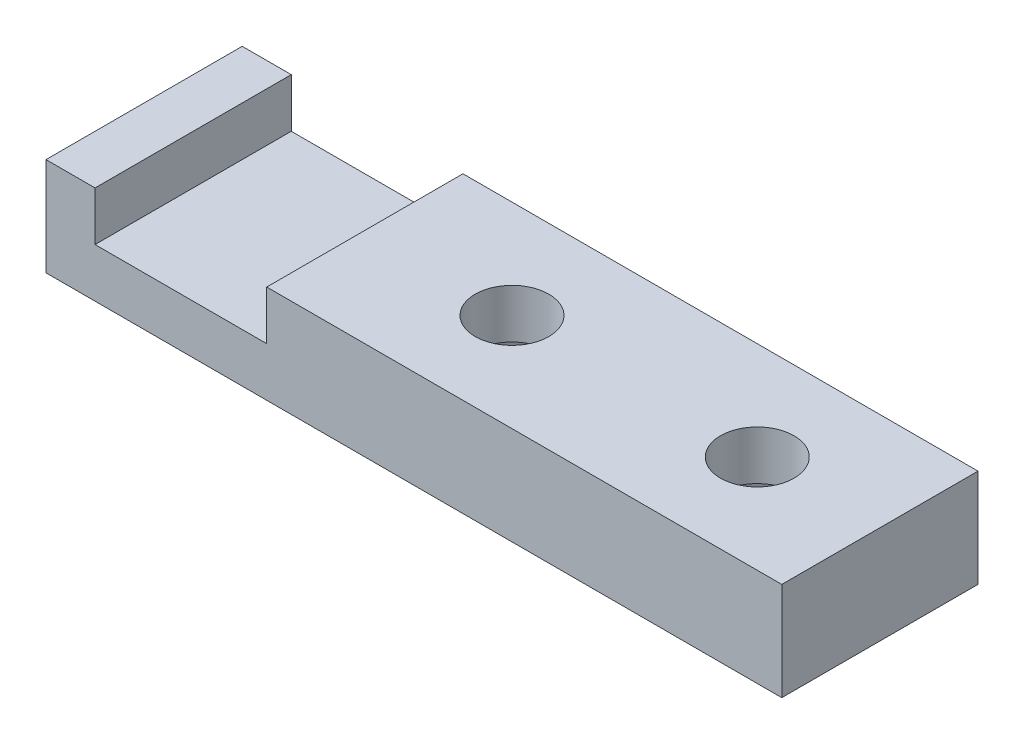
ISO-10303-21;
HEADER;
FILE_DESCRIPTION(('STEP AP214'),'2;1');
FILE_NAME('part.step','',(''),(''),'','','');
FILE_SCHEMA(('AUTOMOTIVE_DESIGN { 1 0 10303 214 1 1 1 1 }'));
ENDSEC;
DATA;
#1=APPLICATION_CONTEXT('core data for automotive mechanical design processes');
#2=APPLICATION_PROTOCOL_DEFINITION('international standard','automotive_design',2000,#1);
#3=PRODUCT_CONTEXT('',#1,'mechanical');
#4=PRODUCT('Part','Part','',(#3));
#5=PRODUCT_RELATED_PRODUCT_CATEGORY('part','',(#4));
#6=PRODUCT_DEFINITION_FORMATION('','',#4);
#7=PRODUCT_DEFINITION_CONTEXT('part definition',#1,'design');
#8=PRODUCT_DEFINITION('design','',#6,#7);
#9=PRODUCT_DEFINITION_SHAPE('','',#8);
#10=(LENGTH_UNIT() NAMED_UNIT(*) SI_UNIT(.MILLI.,.METRE.));
#11=(NAMED_UNIT(*) PLANE_ANGLE_UNIT() SI_UNIT($,.RADIAN.));
#12=(NAMED_UNIT(*) SI_UNIT($,.STERADIAN.) SOLID_ANGLE_UNIT());
#13=UNCERTAINTY_MEASURE_WITH_UNIT(LENGTH_MEASURE(1.E-05),#10,'distance_accuracy_value','');
#14=(GEOMETRIC_REPRESENTATION_CONTEXT(3) GLOBAL_UNCERTAINTY_ASSIGNED_CONTEXT((#13)) GLOBAL_UNIT_ASSIGNED_CONTEXT((#10,
#11,#12)) REPRESENTATION_CONTEXT('',''));
#15=CARTESIAN_POINT('',(0.,0.,0.));
#16=DIRECTION('',(0.,0.,1.));
#17=DIRECTION('',(1.,0.,0.));
#18=AXIS2_PLACEMENT_3D('',#15,#16,#17);
#19=CARTESIAN_POINT('',(15.,10.,4.));
#20=DIRECTION('',(0.,-1.,0.));
#21=DIRECTION('',(0.,0.,-1.));
#22=AXIS2_PLACEMENT_3D('',#19,#20,#21);
#23=CYLINDRICAL_SURFACE('',#22,1.5);
#24=CARTESIAN_POINT('',(15.,4.,4.));
#25=DIRECTION('',(0.,-1.,0.));
#26=DIRECTION('',(0.,0.,-1.));
#27=AXIS2_PLACEMENT_3D('',#24,#25,#26);
#28=CIRCLE('',#27,1.5);
#29=CARTESIAN_POINT('',(15.,4.,2.5));
#30=VERTEX_POINT('',#29);
#31=EDGE_CURVE('E334',#30,#30,#28,.T.);
#32=ORIENTED_EDGE('',*,*,#31,.F.);
#33=EDGE_LOOP('',(#32));
#34=FACE_BOUND('',#33,.T.);
#35=CARTESIAN_POINT('',(15.,2.,4.));
#36=DIRECTION('',(0.,-1.,0.));
#37=DIRECTION('',(0.,0.,-1.));
#38=AXIS2_PLACEMENT_3D('',#35,#36,#37);
#39=CIRCLE('',#38,1.5);
#40=CARTESIAN_POINT('',(15.,2.,2.5));
#41=VERTEX_POINT('',#40);
#42=EDGE_CURVE('E36',#41,#41,#39,.F.);
#43=ORIENTED_EDGE('',*,*,#42,.F.);
#44=EDGE_LOOP('',(#43));
#45=FACE_BOUND('',#44,.T.);
#46=ADVANCED_FACE('F32',(#34,#45),#23,.F.);
#47=CARTESIAN_POINT('',(25.,10.,4.));
#48=DIRECTION('',(0.,-1.,0.));
#49=DIRECTION('',(0.,0.,-1.));
#50=AXIS2_PLACEMENT_3D('',#47,#48,#49);
#51=CYLINDRICAL_SURFACE('',#50,1.5);
#52=CARTESIAN_POINT('',(25.,4.,4.));
#53=DIRECTION('',(0.,-1.,0.));
#54=DIRECTION('',(0.,0.,-1.));
#55=AXIS2_PLACEMENT_3D('',#52,#53,#54);
#56=CIRCLE('',#55,1.5);
#57=CARTESIAN_POINT('',(25.,4.,2.5));
#58=VERTEX_POINT('',#57);
#59=EDGE_CURVE('E277',#58,#58,#56,.T.);
#60=ORIENTED_EDGE('',*,*,#59,.F.);
#61=EDGE_LOOP('',(#60));
#62=FACE_BOUND('',#61,.T.);
#63=CARTESIAN_POINT('',(25.,2.,4.));
#64=DIRECTION('',(0.,-1.,0.));
#65=DIRECTION('',(0.,0.,-1.));
#66=AXIS2_PLACEMENT_3D('',#63,#64,#65);
#67=CIRCLE('',#66,1.5);
#68=CARTESIAN_POINT('',(25.,2.,2.5));
#69=VERTEX_POINT('',#68);
#70=EDGE_CURVE('E263',#69,#69,#67,.F.);
#71=ORIENTED_EDGE('',*,*,#70,.F.);
#72=EDGE_LOOP('',(#71));
#73=FACE_BOUND('',#72,.T.);
#74=ADVANCED_FACE('F341',(#62,#73),#51,.F.);
#75=CARTESIAN_POINT('',(0.,4.,8.));
#76=DIRECTION('',(0.,-1.,0.));
#77=DIRECTION('',(0.,0.,-1.));
#78=AXIS2_PLACEMENT_3D('',#75,#76,#77);
#79=PLANE('',#78);
#80=DIRECTION('',(-1.,0.,0.));
#81=VECTOR('',#80,1.);
#82=CARTESIAN_POINT('',(0.,4.,8.));
#83=LINE('',#82,#81);
#84=CARTESIAN_POINT('',(2.,4.,8.));
#85=VERTEX_POINT('',#84);
#86=CARTESIAN_POINT('',(0.,4.,8.));
#87=VERTEX_POINT('',#86);
#88=EDGE_CURVE('E319',#85,#87,#83,.T.);
#89=ORIENTED_EDGE('',*,*,#88,.F.);
#90=DIRECTION('',(0.,0.,1.));
#91=VECTOR('',#90,1.);
#92=CARTESIAN_POINT('',(2.,4.,0.));
#93=LINE('',#92,#91);
#94=CARTESIAN_POINT('',(2.,4.,0.));
#95=VERTEX_POINT('',#94);
#96=EDGE_CURVE('E304',#95,#85,#93,.T.);
#97=ORIENTED_EDGE('',*,*,#96,.F.);
#98=DIRECTION('',(-1.,0.,0.));
#99=VECTOR('',#98,1.);
#100=CARTESIAN_POINT('',(0.,4.,0.));
#101=LINE('',#100,#99);
#102=CARTESIAN_POINT('',(0.,4.,0.));
#103=VERTEX_POINT('',#102);
#104=EDGE_CURVE('E327',#95,#103,#101,.T.);
#105=ORIENTED_EDGE('',*,*,#104,.T.);
#106=DIRECTION('',(0.,0.,-1.));
#107=VECTOR('',#106,1.);
#108=CARTESIAN_POINT('',(0.,4.,8.));
#109=LINE('',#108,#107);
#110=EDGE_CURVE('E41',#87,#103,#109,.T.);
#111=ORIENTED_EDGE('',*,*,#110,.F.);
#112=EDGE_LOOP('',(#89,#97,#105,#111));
#113=FACE_BOUND('',#112,.T.);
#114=ADVANCED_FACE('F343',(#113),#79,.F.);
#115=CARTESIAN_POINT('',(0.,0.,8.));
#116=DIRECTION('',(1.,0.,0.));
#117=DIRECTION('',(0.,0.,-1.));
#118=AXIS2_PLACEMENT_3D('',#115,#116,#117);
#119=PLANE('',#118);
#120=DIRECTION('',(0.,-1.,0.));
#121=VECTOR('',#120,1.);
#122=CARTESIAN_POINT('',(0.,0.,0.));
#123=LINE('',#122,#121);
#124=CARTESIAN_POINT('',(0.,0.,0.));
#125=VERTEX_POINT('',#124);
#126=EDGE_CURVE('E306',#103,#125,#123,.T.);
#127=ORIENTED_EDGE('',*,*,#126,.T.);
#128=DIRECTION('',(0.,0.,-1.));
#129=VECTOR('',#128,1.);
#130=CARTESIAN_POINT('',(0.,0.,8.));
#131=LINE('',#130,#129);
#132=CARTESIAN_POINT('',(0.,0.,8.));
#133=VERTEX_POINT('',#132);
#134=EDGE_CURVE('E11',#133,#125,#131,.T.);
#135=ORIENTED_EDGE('',*,*,#134,.F.);
#136=DIRECTION('',(0.,-1.,0.));
#137=VECTOR('',#136,1.);
#138=CARTESIAN_POINT('',(0.,0.,8.));
#139=LINE('',#138,#137);
#140=EDGE_CURVE('E313',#87,#133,#139,.T.);
#141=ORIENTED_EDGE('',*,*,#140,.F.);
#142=ORIENTED_EDGE('',*,*,#110,.T.);
#143=EDGE_LOOP('',(#127,#135,#141,#142));
#144=FACE_BOUND('',#143,.T.);
#145=ADVANCED_FACE('F34',(#144),#119,.F.);
#146=CARTESIAN_POINT('',(0.,0.,8.));
#147=DIRECTION('',(0.,1.,0.));
#148=DIRECTION('',(0.,0.,1.));
#149=AXIS2_PLACEMENT_3D('',#146,#147,#148);
#150=PLANE('',#149);
#151=DIRECTION('',(0.5,0.,-0.866025403784439));
#152=VECTOR('',#151,1.);
#153=CARTESIAN_POINT('',(12.,0.,4.));
#154=LINE('',#153,#152);
#155=CARTESIAN_POINT('',(12.,0.,4.));
#156=VERTEX_POINT('',#155);
#157=CARTESIAN_POINT('',(13.5,0.,1.40192378864669));
#158=VERTEX_POINT('',#157);
#159=EDGE_CURVE('E207',#156,#158,#154,.T.);
#160=ORIENTED_EDGE('',*,*,#159,.F.);
#161=DIRECTION('',(-0.5,0.,-0.866025403784439));
#162=VECTOR('',#161,1.);
#163=CARTESIAN_POINT('',(13.5,0.,6.59807621135331));
#164=LINE('',#163,#162);
#165=CARTESIAN_POINT('',(13.5,0.,6.59807621135331));
#166=VERTEX_POINT('',#165);
#167=EDGE_CURVE('E49',#166,#156,#164,.T.);
#168=ORIENTED_EDGE('',*,*,#167,.F.);
#169=DIRECTION('',(-1.,0.,0.));
#170=VECTOR('',#169,1.);
#171=CARTESIAN_POINT('',(16.5,0.,6.59807621135331));
#172=LINE('',#171,#170);
#173=CARTESIAN_POINT('',(16.5,0.,6.59807621135331));
#174=VERTEX_POINT('',#173);
#175=EDGE_CURVE('E193',#174,#166,#172,.T.);
#176=ORIENTED_EDGE('',*,*,#175,.F.);
#177=DIRECTION('',(-0.5,0.,0.866025403784438));
#178=VECTOR('',#177,1.);
#179=CARTESIAN_POINT('',(18.,0.,4.));
#180=LINE('',#179,#178);
#181=CARTESIAN_POINT('',(18.,0.,4.));
#182=VERTEX_POINT('',#181);
#183=EDGE_CURVE('E196',#182,#174,#180,.T.);
#184=ORIENTED_EDGE('',*,*,#183,.F.);
#185=DIRECTION('',(0.5,0.,0.866025403784438));
#186=VECTOR('',#185,1.);
#187=CARTESIAN_POINT('',(16.5,0.,1.40192378864669));
#188=LINE('',#187,#186);
#189=CARTESIAN_POINT('',(16.5,0.,1.40192378864669));
#190=VERTEX_POINT('',#189);
#191=EDGE_CURVE('E212',#190,#182,#188,.T.);
#192=ORIENTED_EDGE('',*,*,#191,.F.);
#193=DIRECTION('',(1.,0.,0.));
#194=VECTOR('',#193,1.);
#195=CARTESIAN_POINT('',(13.5,0.,1.40192378864669));
#196=LINE('',#195,#194);
#197=EDGE_CURVE('E209',#158,#190,#196,.T.);
#198=ORIENTED_EDGE('',*,*,#197,.F.);
#199=EDGE_LOOP('',(#160,#168,#176,#184,#192,#198));
#200=FACE_BOUND('',#199,.T.);
#201=DIRECTION('',(0.5,0.,-0.866025403784438));
#202=VECTOR('',#201,1.);
#203=CARTESIAN_POINT('',(22.,0.,4.));
#204=LINE('',#203,#202);
#205=CARTESIAN_POINT('',(22.,0.,4.));
#206=VERTEX_POINT('',#205);
#207=CARTESIAN_POINT('',(23.5,0.,1.40192378864668));
#208=VERTEX_POINT('',#207);
#209=EDGE_CURVE('E247',#206,#208,#204,.T.);
#210=ORIENTED_EDGE('',*,*,#209,.F.);
#211=DIRECTION('',(-0.5,0.,-0.866025403784439));
#212=VECTOR('',#211,1.);
#213=CARTESIAN_POINT('',(23.5,0.,6.59807621135332));
#214=LINE('',#213,#212);
#215=CARTESIAN_POINT('',(23.5,0.,6.59807621135332));
#216=VERTEX_POINT('',#215);
#217=EDGE_CURVE('E57',#216,#206,#214,.T.);
#218=ORIENTED_EDGE('',*,*,#217,.F.);
#219=DIRECTION('',(-1.,0.,0.));
#220=VECTOR('',#219,1.);
#221=CARTESIAN_POINT('',(26.5,0.,6.59807621135332));
#222=LINE('',#221,#220);
#223=CARTESIAN_POINT('',(26.5,0.,6.59807621135332));
#224=VERTEX_POINT('',#223);
#225=EDGE_CURVE('E230',#224,#216,#222,.T.);
#226=ORIENTED_EDGE('',*,*,#225,.F.);
#227=DIRECTION('',(-0.5,0.,0.866025403784438));
#228=VECTOR('',#227,1.);
#229=CARTESIAN_POINT('',(28.,0.,4.));
#230=LINE('',#229,#228);
#231=CARTESIAN_POINT('',(28.,0.,4.));
#232=VERTEX_POINT('',#231);
#233=EDGE_CURVE('E256',#232,#224,#230,.T.);
#234=ORIENTED_EDGE('',*,*,#233,.F.);
#235=DIRECTION('',(0.499999999999999,0.,0.866025403784439));
#236=VECTOR('',#235,1.);
#237=CARTESIAN_POINT('',(26.5,0.,1.40192378864668));
#238=LINE('',#237,#236);
#239=CARTESIAN_POINT('',(26.5,0.,1.40192378864668));
#240=VERTEX_POINT('',#239);
#241=EDGE_CURVE('E253',#240,#232,#238,.T.);
#242=ORIENTED_EDGE('',*,*,#241,.F.);
#243=DIRECTION('',(1.,0.,0.));
#244=VECTOR('',#243,1.);
#245=CARTESIAN_POINT('',(23.5,0.,1.40192378864668));
#246=LINE('',#245,#244);
#247=EDGE_CURVE('E250',#208,#240,#246,.T.);
#248=ORIENTED_EDGE('',*,*,#247,.F.);
#249=EDGE_LOOP('',(#210,#218,#226,#234,#242,#248));
#250=FACE_BOUND('',#249,.T.);
#251=DIRECTION('',(1.,0.,0.));
#252=VECTOR('',#251,1.);
#253=CARTESIAN_POINT('',(0.,0.,0.));
#254=LINE('',#253,#252);
#255=CARTESIAN_POINT('',(30.,0.,0.));
#256=VERTEX_POINT('',#255);
#257=EDGE_CURVE('E325',#125,#256,#254,.T.);
#258=ORIENTED_EDGE('',*,*,#257,.T.);
#259=DIRECTION('',(0.,0.,-1.));
#260=VECTOR('',#259,1.);
#261=CARTESIAN_POINT('',(30.,0.,8.));
#262=LINE('',#261,#260);
#263=CARTESIAN_POINT('',(30.,0.,8.));
#264=VERTEX_POINT('',#263);
#265=EDGE_CURVE('E276',#264,#256,#262,.T.);
#266=ORIENTED_EDGE('',*,*,#265,.F.);
#267=DIRECTION('',(1.,0.,0.));
#268=VECTOR('',#267,1.);
#269=CARTESIAN_POINT('',(0.,0.,8.));
#270=LINE('',#269,#268);
#271=EDGE_CURVE('E316',#133,#264,#270,.T.);
#272=ORIENTED_EDGE('',*,*,#271,.F.);
#273=ORIENTED_EDGE('',*,*,#134,.T.);
#274=EDGE_LOOP('',(#258,#266,#272,#273));
#275=FACE_BOUND('',#274,.T.);
#276=ADVANCED_FACE('F382',(#200,#250,#275),#150,.F.);
#277=ORIENTED_EDGE('',*,*,#31,.T.);
#278=EDGE_LOOP('',(#277));
#279=FACE_BOUND('',#278,.T.);
#280=ORIENTED_EDGE('',*,*,#59,.T.);
#281=EDGE_LOOP('',(#280));
#282=FACE_BOUND('',#281,.T.);
#283=CARTESIAN_POINT('',(30.,4.00000000000001,0.));
#284=VERTEX_POINT('',#283);
#285=CARTESIAN_POINT('',(9.,4.,0.));
#286=VERTEX_POINT('',#285);
#287=EDGE_CURVE('E317',#284,#286,#101,.T.);
#288=ORIENTED_EDGE('',*,*,#287,.T.);
#289=DIRECTION('',(0.,0.,1.));
#290=VECTOR('',#289,1.);
#291=CARTESIAN_POINT('',(9.,4.,0.));
#292=LINE('',#291,#290);
#293=CARTESIAN_POINT('',(9.,4.,8.));
#294=VERTEX_POINT('',#293);
#295=EDGE_CURVE('E307',#286,#294,#292,.T.);
#296=ORIENTED_EDGE('',*,*,#295,.T.);
#297=CARTESIAN_POINT('',(30.,4.00000000000001,8.));
#298=VERTEX_POINT('',#297);
#299=EDGE_CURVE('E320',#298,#294,#83,.T.);
#300=ORIENTED_EDGE('',*,*,#299,.F.);
#301=DIRECTION('',(0.,0.,1.));
#302=VECTOR('',#301,1.);
#303=CARTESIAN_POINT('',(30.,4.00000000000001,8.));
#304=LINE('',#303,#302);
#305=EDGE_CURVE('E283',#284,#298,#304,.T.);
#306=ORIENTED_EDGE('',*,*,#305,.F.);
#307=EDGE_LOOP('',(#288,#296,#300,#306));
#308=FACE_BOUND('',#307,.T.);
#309=ADVANCED_FACE('F352',(#279,#282,#308),#79,.F.);
#310=CARTESIAN_POINT('',(0.,0.,8.));
#311=DIRECTION('',(0.,0.,-1.));
#312=DIRECTION('',(-1.,0.,0.));
#313=AXIS2_PLACEMENT_3D('',#310,#311,#312);
#314=PLANE('',#313);
#315=DIRECTION('',(1.,0.,0.));
#316=VECTOR('',#315,1.);
#317=CARTESIAN_POINT('',(2.,2.,8.));
#318=LINE('',#317,#316);
#319=CARTESIAN_POINT('',(2.,2.,8.));
#320=VERTEX_POINT('',#319);
#321=CARTESIAN_POINT('',(9.,2.,8.));
#322=VERTEX_POINT('',#321);
#323=EDGE_CURVE('E300',#320,#322,#318,.T.);
#324=ORIENTED_EDGE('',*,*,#323,.F.);
#325=DIRECTION('',(0.,-1.,0.));
#326=VECTOR('',#325,1.);
#327=CARTESIAN_POINT('',(2.,4.,8.));
#328=LINE('',#327,#326);
#329=EDGE_CURVE('E286',#85,#320,#328,.T.);
#330=ORIENTED_EDGE('',*,*,#329,.F.);
#331=ORIENTED_EDGE('',*,*,#88,.T.);
#332=ORIENTED_EDGE('',*,*,#140,.T.);
#333=ORIENTED_EDGE('',*,*,#271,.T.);
#334=DIRECTION('',(0.,-1.,0.));
#335=VECTOR('',#334,1.);
#336=CARTESIAN_POINT('',(30.,0.,8.));
#337=LINE('',#336,#335);
#338=EDGE_CURVE('E273',#298,#264,#337,.T.);
#339=ORIENTED_EDGE('',*,*,#338,.F.);
#340=ORIENTED_EDGE('',*,*,#299,.T.);
#341=DIRECTION('',(0.,1.,0.));
#342=VECTOR('',#341,1.);
#343=CARTESIAN_POINT('',(9.,4.,8.));
#344=LINE('',#343,#342);
#345=EDGE_CURVE('E291',#322,#294,#344,.T.);
#346=ORIENTED_EDGE('',*,*,#345,.F.);
#347=EDGE_LOOP('',(#324,#330,#331,#332,#333,#339,#340,#346));
#348=FACE_BOUND('',#347,.T.);
#349=ADVANCED_FACE('F375',(#348),#314,.F.);
#350=CARTESIAN_POINT('',(0.,0.,0.));
#351=DIRECTION('',(0.,0.,-1.));
#352=DIRECTION('',(-1.,0.,0.));
#353=AXIS2_PLACEMENT_3D('',#350,#351,#352);
#354=PLANE('',#353);
#355=DIRECTION('',(0.,-1.,0.));
#356=VECTOR('',#355,1.);
#357=CARTESIAN_POINT('',(2.,4.,0.));
#358=LINE('',#357,#356);
#359=CARTESIAN_POINT('',(2.,2.,0.));
#360=VERTEX_POINT('',#359);
#361=EDGE_CURVE('E287',#95,#360,#358,.T.);
#362=ORIENTED_EDGE('',*,*,#361,.T.);
#363=DIRECTION('',(1.,0.,0.));
#364=VECTOR('',#363,1.);
#365=CARTESIAN_POINT('',(2.,2.,0.));
#366=LINE('',#365,#364);
#367=CARTESIAN_POINT('',(9.,2.,0.));
#368=VERTEX_POINT('',#367);
#369=EDGE_CURVE('E290',#360,#368,#366,.T.);
#370=ORIENTED_EDGE('',*,*,#369,.T.);
#371=DIRECTION('',(0.,1.,0.));
#372=VECTOR('',#371,1.);
#373=CARTESIAN_POINT('',(9.,4.,0.));
#374=LINE('',#373,#372);
#375=EDGE_CURVE('E294',#368,#286,#374,.T.);
#376=ORIENTED_EDGE('',*,*,#375,.T.);
#377=ORIENTED_EDGE('',*,*,#287,.F.);
#378=DIRECTION('',(0.,1.,0.));
#379=VECTOR('',#378,1.);
#380=CARTESIAN_POINT('',(30.,0.,0.));
#381=LINE('',#380,#379);
#382=EDGE_CURVE('E280',#256,#284,#381,.T.);
#383=ORIENTED_EDGE('',*,*,#382,.F.);
#384=ORIENTED_EDGE('',*,*,#257,.F.);
#385=ORIENTED_EDGE('',*,*,#126,.F.);
#386=ORIENTED_EDGE('',*,*,#104,.F.);
#387=EDGE_LOOP('',(#362,#370,#376,#377,#383,#384,#385,#386));
#388=FACE_BOUND('',#387,.T.);
#389=ADVANCED_FACE('F373',(#388),#354,.T.);
#390=CARTESIAN_POINT('',(2.,4.,0.));
#391=DIRECTION('',(-1.,0.,0.));
#392=DIRECTION('',(0.,-1.,0.));
#393=AXIS2_PLACEMENT_3D('',#390,#391,#392);
#394=PLANE('',#393);
#395=ORIENTED_EDGE('',*,*,#329,.T.);
#396=DIRECTION('',(0.,0.,1.));
#397=VECTOR('',#396,1.);
#398=CARTESIAN_POINT('',(2.,2.,0.));
#399=LINE('',#398,#397);
#400=EDGE_CURVE('E297',#360,#320,#399,.T.);
#401=ORIENTED_EDGE('',*,*,#400,.F.);
#402=ORIENTED_EDGE('',*,*,#361,.F.);
#403=ORIENTED_EDGE('',*,*,#96,.T.);
#404=EDGE_LOOP('',(#395,#401,#402,#403));
#405=FACE_BOUND('',#404,.T.);
#406=ADVANCED_FACE('F366',(#405),#394,.F.);
#407=CARTESIAN_POINT('',(9.,4.,0.));
#408=DIRECTION('',(1.,0.,0.));
#409=DIRECTION('',(0.,0.,-1.));
#410=AXIS2_PLACEMENT_3D('',#407,#408,#409);
#411=PLANE('',#410);
#412=ORIENTED_EDGE('',*,*,#345,.T.);
#413=ORIENTED_EDGE('',*,*,#295,.F.);
#414=ORIENTED_EDGE('',*,*,#375,.F.);
#415=DIRECTION('',(0.,0.,1.));
#416=VECTOR('',#415,1.);
#417=CARTESIAN_POINT('',(9.,2.,0.));
#418=LINE('',#417,#416);
#419=EDGE_CURVE('E310',#368,#322,#418,.T.);
#420=ORIENTED_EDGE('',*,*,#419,.T.);
#421=EDGE_LOOP('',(#412,#413,#414,#420));
#422=FACE_BOUND('',#421,.T.);
#423=ADVANCED_FACE('F363',(#422),#411,.F.);
#424=CARTESIAN_POINT('',(2.,2.,0.));
#425=DIRECTION('',(0.,-1.,0.));
#426=DIRECTION('',(0.,0.,-1.));
#427=AXIS2_PLACEMENT_3D('',#424,#425,#426);
#428=PLANE('',#427);
#429=ORIENTED_EDGE('',*,*,#323,.T.);
#430=ORIENTED_EDGE('',*,*,#419,.F.);
#431=ORIENTED_EDGE('',*,*,#369,.F.);
#432=ORIENTED_EDGE('',*,*,#400,.T.);
#433=EDGE_LOOP('',(#429,#430,#431,#432));
#434=FACE_BOUND('',#433,.T.);
#435=ADVANCED_FACE('F361',(#434),#428,.F.);
#436=CARTESIAN_POINT('',(30.,0.,0.));
#437=DIRECTION('',(-1.,0.,0.));
#438=DIRECTION('',(0.,-1.,0.));
#439=AXIS2_PLACEMENT_3D('',#436,#437,#438);
#440=PLANE('',#439);
#441=ORIENTED_EDGE('',*,*,#338,.T.);
#442=ORIENTED_EDGE('',*,*,#265,.T.);
#443=ORIENTED_EDGE('',*,*,#382,.T.);
#444=ORIENTED_EDGE('',*,*,#305,.T.);
#445=EDGE_LOOP('',(#441,#442,#443,#444));
#446=FACE_BOUND('',#445,.T.);
#447=ADVANCED_FACE('F358',(#446),#440,.F.);
#448=CARTESIAN_POINT('',(0.,2.,0.));
#449=DIRECTION('',(0.,-1.,0.));
#450=DIRECTION('',(0.,0.,-1.));
#451=AXIS2_PLACEMENT_3D('',#448,#449,#450);
#452=PLANE('',#451);
#453=DIRECTION('',(-0.5,0.,-0.866025403784439));
#454=VECTOR('',#453,1.);
#455=CARTESIAN_POINT('',(23.5,2.,6.59807621135332));
#456=LINE('',#455,#454);
#457=CARTESIAN_POINT('',(23.5,2.,6.59807621135332));
#458=VERTEX_POINT('',#457);
#459=CARTESIAN_POINT('',(22.,2.,4.));
#460=VERTEX_POINT('',#459);
#461=EDGE_CURVE('E226',#458,#460,#456,.T.);
#462=ORIENTED_EDGE('',*,*,#461,.T.);
#463=DIRECTION('',(0.5,0.,-0.866025403784438));
#464=VECTOR('',#463,1.);
#465=CARTESIAN_POINT('',(22.,2.,4.));
#466=LINE('',#465,#464);
#467=CARTESIAN_POINT('',(23.5,2.,1.40192378864668));
#468=VERTEX_POINT('',#467);
#469=EDGE_CURVE('E229',#460,#468,#466,.T.);
#470=ORIENTED_EDGE('',*,*,#469,.T.);
#471=DIRECTION('',(1.,0.,0.));
#472=VECTOR('',#471,1.);
#473=CARTESIAN_POINT('',(23.5,2.,1.40192378864668));
#474=LINE('',#473,#472);
#475=CARTESIAN_POINT('',(26.5,2.,1.40192378864668));
#476=VERTEX_POINT('',#475);
#477=EDGE_CURVE('E233',#468,#476,#474,.T.);
#478=ORIENTED_EDGE('',*,*,#477,.T.);
#479=DIRECTION('',(0.499999999999999,0.,0.866025403784439));
#480=VECTOR('',#479,1.);
#481=CARTESIAN_POINT('',(26.5,2.,1.40192378864668));
#482=LINE('',#481,#480);
#483=CARTESIAN_POINT('',(28.,2.,4.));
#484=VERTEX_POINT('',#483);
#485=EDGE_CURVE('E236',#476,#484,#482,.T.);
#486=ORIENTED_EDGE('',*,*,#485,.T.);
#487=DIRECTION('',(-0.5,0.,0.866025403784438));
#488=VECTOR('',#487,1.);
#489=CARTESIAN_POINT('',(28.,2.,4.));
#490=LINE('',#489,#488);
#491=CARTESIAN_POINT('',(26.5,2.,6.59807621135332));
#492=VERTEX_POINT('',#491);
#493=EDGE_CURVE('E239',#484,#492,#490,.T.);
#494=ORIENTED_EDGE('',*,*,#493,.T.);
#495=DIRECTION('',(-1.,0.,0.));
#496=VECTOR('',#495,1.);
#497=CARTESIAN_POINT('',(26.5,2.,6.59807621135332));
#498=LINE('',#497,#496);
#499=EDGE_CURVE('E242',#492,#458,#498,.T.);
#500=ORIENTED_EDGE('',*,*,#499,.T.);
#501=EDGE_LOOP('',(#462,#470,#478,#486,#494,#500));
#502=FACE_BOUND('',#501,.T.);
#503=ORIENTED_EDGE('',*,*,#70,.T.);
#504=EDGE_LOOP('',(#503));
#505=FACE_BOUND('',#504,.T.);
#506=ADVANCED_FACE('F339',(#502,#505),#452,.T.);
#507=CARTESIAN_POINT('',(23.5,2.,6.59807621135332));
#508=DIRECTION('',(-0.866025403784439,0.,0.5));
#509=DIRECTION('',(0.5,0.,0.866025403784439));
#510=AXIS2_PLACEMENT_3D('',#507,#508,#509);
#511=PLANE('',#510);
#512=ORIENTED_EDGE('',*,*,#217,.T.);
#513=DIRECTION('',(0.,-1.,0.));
#514=VECTOR('',#513,1.);
#515=CARTESIAN_POINT('',(22.,2.,4.));
#516=LINE('',#515,#514);
#517=EDGE_CURVE('E245',#460,#206,#516,.T.);
#518=ORIENTED_EDGE('',*,*,#517,.F.);
#519=ORIENTED_EDGE('',*,*,#461,.F.);
#520=DIRECTION('',(0.,-1.,0.));
#521=VECTOR('',#520,1.);
#522=CARTESIAN_POINT('',(23.5,2.,6.59807621135332));
#523=LINE('',#522,#521);
#524=EDGE_CURVE('E261',#458,#216,#523,.T.);
#525=ORIENTED_EDGE('',*,*,#524,.T.);
#526=EDGE_LOOP('',(#512,#518,#519,#525));
#527=FACE_BOUND('',#526,.T.);
#528=ADVANCED_FACE('F419',(#527),#511,.F.);
#529=CARTESIAN_POINT('',(26.5,2.,6.59807621135332));
#530=DIRECTION('',(0.,0.,1.));
#531=DIRECTION('',(1.,0.,0.));
#532=AXIS2_PLACEMENT_3D('',#529,#530,#531);
#533=PLANE('',#532);
#534=ORIENTED_EDGE('',*,*,#225,.T.);
#535=ORIENTED_EDGE('',*,*,#524,.F.);
#536=ORIENTED_EDGE('',*,*,#499,.F.);
#537=DIRECTION('',(0.,-1.,0.));
#538=VECTOR('',#537,1.);
#539=CARTESIAN_POINT('',(26.5,2.,6.59807621135332));
#540=LINE('',#539,#538);
#541=EDGE_CURVE('E264',#492,#224,#540,.T.);
#542=ORIENTED_EDGE('',*,*,#541,.T.);
#543=EDGE_LOOP('',(#534,#535,#536,#542));
#544=FACE_BOUND('',#543,.T.);
#545=ADVANCED_FACE('F424',(#544),#533,.F.);
#546=CARTESIAN_POINT('',(28.,2.,4.));
#547=DIRECTION('',(0.866025403784439,0.,0.5));
#548=DIRECTION('',(0.5,0.,-0.866025403784438));
#549=AXIS2_PLACEMENT_3D('',#546,#547,#548);
#550=PLANE('',#549);
#551=ORIENTED_EDGE('',*,*,#233,.T.);
#552=ORIENTED_EDGE('',*,*,#541,.F.);
#553=ORIENTED_EDGE('',*,*,#493,.F.);
#554=DIRECTION('',(0.,-1.,0.));
#555=VECTOR('',#554,1.);
#556=CARTESIAN_POINT('',(28.,2.,4.));
#557=LINE('',#556,#555);
#558=EDGE_CURVE('E266',#484,#232,#557,.T.);
#559=ORIENTED_EDGE('',*,*,#558,.T.);
#560=EDGE_LOOP('',(#551,#552,#553,#559));
#561=FACE_BOUND('',#560,.T.);
#562=ADVANCED_FACE('F427',(#561),#550,.F.);
#563=CARTESIAN_POINT('',(26.5,2.,1.40192378864668));
#564=DIRECTION('',(0.866025403784439,0.,-0.499999999999999));
#565=DIRECTION('',(-0.499999999999999,0.,-0.866025403784439));
#566=AXIS2_PLACEMENT_3D('',#563,#564,#565);
#567=PLANE('',#566);
#568=ORIENTED_EDGE('',*,*,#241,.T.);
#569=ORIENTED_EDGE('',*,*,#558,.F.);
#570=ORIENTED_EDGE('',*,*,#485,.F.);
#571=DIRECTION('',(0.,-1.,0.));
#572=VECTOR('',#571,1.);
#573=CARTESIAN_POINT('',(26.5,2.,1.40192378864668));
#574=LINE('',#573,#572);
#575=EDGE_CURVE('E268',#476,#240,#574,.T.);
#576=ORIENTED_EDGE('',*,*,#575,.T.);
#577=EDGE_LOOP('',(#568,#569,#570,#576));
#578=FACE_BOUND('',#577,.T.);
#579=ADVANCED_FACE('F430',(#578),#567,.F.);
#580=CARTESIAN_POINT('',(23.5,2.,1.40192378864668));
#581=DIRECTION('',(0.,0.,-1.));
#582=DIRECTION('',(-1.,0.,0.));
#583=AXIS2_PLACEMENT_3D('',#580,#581,#582);
#584=PLANE('',#583);
#585=ORIENTED_EDGE('',*,*,#247,.T.);
#586=ORIENTED_EDGE('',*,*,#575,.F.);
#587=ORIENTED_EDGE('',*,*,#477,.F.);
#588=DIRECTION('',(0.,-1.,0.));
#589=VECTOR('',#588,1.);
#590=CARTESIAN_POINT('',(23.5,2.,1.40192378864668));
#591=LINE('',#590,#589);
#592=EDGE_CURVE('E270',#468,#208,#591,.T.);
#593=ORIENTED_EDGE('',*,*,#592,.T.);
#594=EDGE_LOOP('',(#585,#586,#587,#593));
#595=FACE_BOUND('',#594,.T.);
#596=ADVANCED_FACE('F432',(#595),#584,.F.);
#597=CARTESIAN_POINT('',(22.,2.,4.));
#598=DIRECTION('',(-0.866025403784438,0.,-0.500000000000001));
#599=DIRECTION('',(-0.500000000000001,0.,0.866025403784438));
#600=AXIS2_PLACEMENT_3D('',#597,#598,#599);
#601=PLANE('',#600);
#602=ORIENTED_EDGE('',*,*,#209,.T.);
#603=ORIENTED_EDGE('',*,*,#592,.F.);
#604=ORIENTED_EDGE('',*,*,#469,.F.);
#605=ORIENTED_EDGE('',*,*,#517,.T.);
#606=EDGE_LOOP('',(#602,#603,#604,#605));
#607=FACE_BOUND('',#606,.T.);
#608=ADVANCED_FACE('F415',(#607),#601,.F.);
#609=CARTESIAN_POINT('',(0.,2.,0.));
#610=DIRECTION('',(0.,-1.,0.));
#611=DIRECTION('',(0.,0.,-1.));
#612=AXIS2_PLACEMENT_3D('',#609,#610,#611);
#613=PLANE('',#612);
#614=DIRECTION('',(-0.5,0.,-0.866025403784439));
#615=VECTOR('',#614,1.);
#616=CARTESIAN_POINT('',(13.5,2.,6.59807621135331));
#617=LINE('',#616,#615);
#618=CARTESIAN_POINT('',(13.5,2.,6.59807621135331));
#619=VERTEX_POINT('',#618);
#620=CARTESIAN_POINT('',(12.,2.,4.));
#621=VERTEX_POINT('',#620);
#622=EDGE_CURVE('E173',#619,#621,#617,.T.);
#623=ORIENTED_EDGE('',*,*,#622,.T.);
#624=DIRECTION('',(0.5,0.,-0.866025403784439));
#625=VECTOR('',#624,1.);
#626=CARTESIAN_POINT('',(12.,2.,4.));
#627=LINE('',#626,#625);
#628=CARTESIAN_POINT('',(13.5,2.,1.40192378864669));
#629=VERTEX_POINT('',#628);
#630=EDGE_CURVE('E182',#621,#629,#627,.T.);
#631=ORIENTED_EDGE('',*,*,#630,.T.);
#632=DIRECTION('',(1.,0.,0.));
#633=VECTOR('',#632,1.);
#634=CARTESIAN_POINT('',(13.5,2.,1.40192378864669));
#635=LINE('',#634,#633);
#636=CARTESIAN_POINT('',(16.5,2.,1.40192378864669));
#637=VERTEX_POINT('',#636);
#638=EDGE_CURVE('E187',#629,#637,#635,.T.);
#639=ORIENTED_EDGE('',*,*,#638,.T.);
#640=DIRECTION('',(0.5,0.,0.866025403784438));
#641=VECTOR('',#640,1.);
#642=CARTESIAN_POINT('',(16.5,2.,1.40192378864669));
#643=LINE('',#642,#641);
#644=CARTESIAN_POINT('',(18.,2.,4.));
#645=VERTEX_POINT('',#644);
#646=EDGE_CURVE('E200',#637,#645,#643,.T.);
#647=ORIENTED_EDGE('',*,*,#646,.T.);
#648=DIRECTION('',(-0.5,0.,0.866025403784438));
#649=VECTOR('',#648,1.);
#650=CARTESIAN_POINT('',(18.,2.,4.));
#651=LINE('',#650,#649);
#652=CARTESIAN_POINT('',(16.5,2.,6.59807621135331));
#653=VERTEX_POINT('',#652);
#654=EDGE_CURVE('E203',#645,#653,#651,.T.);
#655=ORIENTED_EDGE('',*,*,#654,.T.);
#656=DIRECTION('',(-1.,0.,0.));
#657=VECTOR('',#656,1.);
#658=CARTESIAN_POINT('',(16.5,2.,6.59807621135331));
#659=LINE('',#658,#657);
#660=EDGE_CURVE('E179',#653,#619,#659,.T.);
#661=ORIENTED_EDGE('',*,*,#660,.T.);
#662=EDGE_LOOP('',(#623,#631,#639,#647,#655,#661));
#663=FACE_BOUND('',#662,.T.);
#664=ORIENTED_EDGE('',*,*,#42,.T.);
#665=EDGE_LOOP('',(#664));
#666=FACE_BOUND('',#665,.T.);
#667=ADVANCED_FACE('F189',(#663,#666),#613,.T.);
#668=CARTESIAN_POINT('',(13.5,2.,6.59807621135331));
#669=DIRECTION('',(-0.866025403784439,0.,0.5));
#670=DIRECTION('',(0.5,0.,0.866025403784439));
#671=AXIS2_PLACEMENT_3D('',#668,#669,#670);
#672=PLANE('',#671);
#673=ORIENTED_EDGE('',*,*,#167,.T.);
#674=DIRECTION('',(0.,-1.,0.));
#675=VECTOR('',#674,1.);
#676=CARTESIAN_POINT('',(12.,2.,4.));
#677=LINE('',#676,#675);
#678=EDGE_CURVE('E169',#621,#156,#677,.T.);
#679=ORIENTED_EDGE('',*,*,#678,.F.);
#680=ORIENTED_EDGE('',*,*,#622,.F.);
#681=DIRECTION('',(0.,-1.,0.));
#682=VECTOR('',#681,1.);
#683=CARTESIAN_POINT('',(13.5,2.,6.59807621135331));
#684=LINE('',#683,#682);
#685=EDGE_CURVE('E217',#619,#166,#684,.T.);
#686=ORIENTED_EDGE('',*,*,#685,.T.);
#687=EDGE_LOOP('',(#673,#679,#680,#686));
#688=FACE_BOUND('',#687,.T.);
#689=ADVANCED_FACE('F171',(#688),#672,.F.);
#690=CARTESIAN_POINT('',(16.5,2.,6.59807621135331));
#691=DIRECTION('',(0.,0.,1.));
#692=DIRECTION('',(1.,0.,0.));
#693=AXIS2_PLACEMENT_3D('',#690,#691,#692);
#694=PLANE('',#693);
#695=ORIENTED_EDGE('',*,*,#175,.T.);
#696=ORIENTED_EDGE('',*,*,#685,.F.);
#697=ORIENTED_EDGE('',*,*,#660,.F.);
#698=DIRECTION('',(0.,-1.,0.));
#699=VECTOR('',#698,1.);
#700=CARTESIAN_POINT('',(16.5,2.,6.59807621135331));
#701=LINE('',#700,#699);
#702=EDGE_CURVE('E219',#653,#174,#701,.T.);
#703=ORIENTED_EDGE('',*,*,#702,.T.);
#704=EDGE_LOOP('',(#695,#696,#697,#703));
#705=FACE_BOUND('',#704,.T.);
#706=ADVANCED_FACE('F489',(#705),#694,.F.);
#707=CARTESIAN_POINT('',(18.,2.,4.));
#708=DIRECTION('',(0.866025403784438,0.,0.5));
#709=DIRECTION('',(0.5,0.,-0.866025403784438));
#710=AXIS2_PLACEMENT_3D('',#707,#708,#709);
#711=PLANE('',#710);
#712=ORIENTED_EDGE('',*,*,#183,.T.);
#713=ORIENTED_EDGE('',*,*,#702,.F.);
#714=ORIENTED_EDGE('',*,*,#654,.F.);
#715=DIRECTION('',(0.,-1.,0.));
#716=VECTOR('',#715,1.);
#717=CARTESIAN_POINT('',(18.,2.,4.));
#718=LINE('',#717,#716);
#719=EDGE_CURVE('E221',#645,#182,#718,.T.);
#720=ORIENTED_EDGE('',*,*,#719,.T.);
#721=EDGE_LOOP('',(#712,#713,#714,#720));
#722=FACE_BOUND('',#721,.T.);
#723=ADVANCED_FACE('F497',(#722),#711,.F.);
#724=CARTESIAN_POINT('',(16.5,2.,1.40192378864669));
#725=DIRECTION('',(0.866025403784438,0.,-0.5));
#726=DIRECTION('',(-0.5,0.,-0.866025403784438));
#727=AXIS2_PLACEMENT_3D('',#724,#725,#726);
#728=PLANE('',#727);
#729=ORIENTED_EDGE('',*,*,#191,.T.);
#730=ORIENTED_EDGE('',*,*,#719,.F.);
#731=ORIENTED_EDGE('',*,*,#646,.F.);
#732=DIRECTION('',(0.,-1.,0.));
#733=VECTOR('',#732,1.);
#734=CARTESIAN_POINT('',(16.5,2.,1.40192378864669));
#735=LINE('',#734,#733);
#736=EDGE_CURVE('E223',#637,#190,#735,.T.);
#737=ORIENTED_EDGE('',*,*,#736,.T.);
#738=EDGE_LOOP('',(#729,#730,#731,#737));
#739=FACE_BOUND('',#738,.T.);
#740=ADVANCED_FACE('F507',(#739),#728,.F.);
#741=CARTESIAN_POINT('',(13.5,2.,1.40192378864669));
#742=DIRECTION('',(0.,0.,-1.));
#743=DIRECTION('',(-1.,0.,0.));
#744=AXIS2_PLACEMENT_3D('',#741,#742,#743);
#745=PLANE('',#744);
#746=ORIENTED_EDGE('',*,*,#197,.T.);
#747=ORIENTED_EDGE('',*,*,#736,.F.);
#748=ORIENTED_EDGE('',*,*,#638,.F.);
#749=DIRECTION('',(0.,-1.,0.));
#750=VECTOR('',#749,1.);
#751=CARTESIAN_POINT('',(13.5,2.,1.40192378864669));
#752=LINE('',#751,#750);
#753=EDGE_CURVE('E178',#629,#158,#752,.T.);
#754=ORIENTED_EDGE('',*,*,#753,.T.);
#755=EDGE_LOOP('',(#746,#747,#748,#754));
#756=FACE_BOUND('',#755,.T.);
#757=ADVANCED_FACE('F517',(#756),#745,.F.);
#758=CARTESIAN_POINT('',(12.,2.,4.));
#759=DIRECTION('',(-0.866025403784439,0.,-0.5));
#760=DIRECTION('',(-0.5,0.,0.866025403784439));
#761=AXIS2_PLACEMENT_3D('',#758,#759,#760);
#762=PLANE('',#761);
#763=ORIENTED_EDGE('',*,*,#159,.T.);
#764=ORIENTED_EDGE('',*,*,#753,.F.);
#765=ORIENTED_EDGE('',*,*,#630,.F.);
#766=ORIENTED_EDGE('',*,*,#678,.T.);
#767=EDGE_LOOP('',(#763,#764,#765,#766));
#768=FACE_BOUND('',#767,.T.);
#769=ADVANCED_FACE('F183',(#768),#762,.F.);
#770=CLOSED_SHELL('',(#46,#74,#114,#145,#276,#309,#349,#389,#406,#423,#435,#447,#506,#528,#545,
#562,#579,#596,#608,#667,#689,#706,#723,#740,#757,#769));
#771=MANIFOLD_SOLID_BREP('B2',#770);
#772=ADVANCED_BREP_SHAPE_REPRESENTATION('',(#18,#771),#14);
#773=SHAPE_DEFINITION_REPRESENTATION(#9,#772);
ENDSEC;
END-ISO-10303-21;
